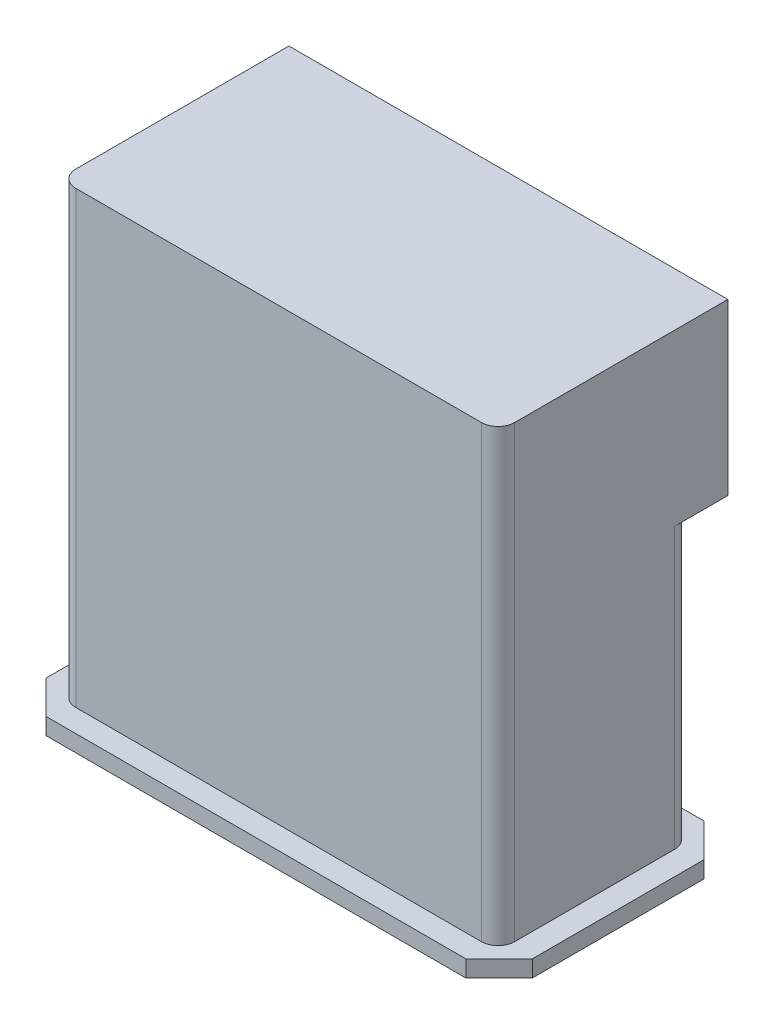
ISO-10303-21;
HEADER;
FILE_DESCRIPTION(('STEP AP214'),'2;1');
FILE_NAME('part.step','',(''),(''),'','','');
FILE_SCHEMA(('AUTOMOTIVE_DESIGN { 1 0 10303 214 1 1 1 1 }'));
ENDSEC;
DATA;
#1=APPLICATION_CONTEXT('core data for automotive mechanical design processes');
#2=APPLICATION_PROTOCOL_DEFINITION('international standard','automotive_design',2000,#1);
#3=PRODUCT_CONTEXT('',#1,'mechanical');
#4=PRODUCT('Part','Part','',(#3));
#5=PRODUCT_RELATED_PRODUCT_CATEGORY('part','',(#4));
#6=PRODUCT_DEFINITION_FORMATION('','',#4);
#7=PRODUCT_DEFINITION_CONTEXT('part definition',#1,'design');
#8=PRODUCT_DEFINITION('design','',#6,#7);
#9=PRODUCT_DEFINITION_SHAPE('','',#8);
#10=(LENGTH_UNIT() NAMED_UNIT(*) SI_UNIT(.MILLI.,.METRE.));
#11=(NAMED_UNIT(*) PLANE_ANGLE_UNIT() SI_UNIT($,.RADIAN.));
#12=(NAMED_UNIT(*) SI_UNIT($,.STERADIAN.) SOLID_ANGLE_UNIT());
#13=UNCERTAINTY_MEASURE_WITH_UNIT(LENGTH_MEASURE(1.E-05),#10,'distance_accuracy_value','');
#14=(GEOMETRIC_REPRESENTATION_CONTEXT(3) GLOBAL_UNCERTAINTY_ASSIGNED_CONTEXT((#13)) GLOBAL_UNIT_ASSIGNED_CONTEXT((#10,
#11,#12)) REPRESENTATION_CONTEXT('',''));
#15=CARTESIAN_POINT('',(0.,0.,0.));
#16=DIRECTION('',(0.,0.,1.));
#17=DIRECTION('',(1.,0.,0.));
#18=AXIS2_PLACEMENT_3D('',#15,#16,#17);
#19=CARTESIAN_POINT('',(0.0899999999999998,-30.5,-7.9));
#20=DIRECTION('',(0.,1.,0.));
#21=DIRECTION('',(0.707106781186548,0.,-0.707106781186547));
#22=AXIS2_PLACEMENT_3D('',#19,#20,#21);
#23=CYLINDRICAL_SURFACE('',#22,0.5);
#24=CARTESIAN_POINT('',(0.0899999999999998,-21.6,-7.9));
#25=DIRECTION('',(0.,-1.,0.));
#26=DIRECTION('',(0.707106781186548,0.,-0.707106781186547));
#27=AXIS2_PLACEMENT_3D('',#24,#25,#26);
#28=CIRCLE('',#27,0.5);
#29=CARTESIAN_POINT('',(0.0899999999999998,-21.6,-8.4));
#30=VERTEX_POINT('',#29);
#31=CARTESIAN_POINT('',(0.59,-21.6,-7.9));
#32=VERTEX_POINT('',#31);
#33=EDGE_CURVE('E10',#30,#32,#28,.T.);
#34=ORIENTED_EDGE('',*,*,#33,.T.);
#35=DIRECTION('',(0.,-1.,0.));
#36=VECTOR('',#35,1.);
#37=CARTESIAN_POINT('',(0.59,-30.5,-7.9));
#38=LINE('',#37,#36);
#39=CARTESIAN_POINT('',(0.59,-30.,-7.9));
#40=VERTEX_POINT('',#39);
#41=EDGE_CURVE('E26',#32,#40,#38,.T.);
#42=ORIENTED_EDGE('',*,*,#41,.T.);
#43=CARTESIAN_POINT('',(0.0899999999999998,-30.,-7.9));
#44=DIRECTION('',(0.,1.,0.));
#45=DIRECTION('',(0.707106781186548,0.,-0.707106781186547));
#46=AXIS2_PLACEMENT_3D('',#43,#44,#45);
#47=CIRCLE('',#46,0.5);
#48=CARTESIAN_POINT('',(0.0899999999999998,-30.,-8.4));
#49=VERTEX_POINT('',#48);
#50=EDGE_CURVE('E50',#40,#49,#47,.T.);
#51=ORIENTED_EDGE('',*,*,#50,.T.);
#52=DIRECTION('',(0.,1.,0.));
#53=VECTOR('',#52,1.);
#54=CARTESIAN_POINT('',(0.0899999999999998,-30.5,-8.4));
#55=LINE('',#54,#53);
#56=EDGE_CURVE('E397',#49,#30,#55,.T.);
#57=ORIENTED_EDGE('',*,*,#56,.T.);
#58=EDGE_LOOP('',(#34,#42,#51,#57));
#59=FACE_BOUND('',#58,.T.);
#60=ADVANCED_FACE('F16',(#59),#23,.T.);
#61=CARTESIAN_POINT('',(0.59,-30.5,-2.6));
#62=DIRECTION('',(1.,0.,0.));
#63=DIRECTION('',(0.,1.,0.));
#64=AXIS2_PLACEMENT_3D('',#61,#62,#63);
#65=PLANE('',#64);
#66=ORIENTED_EDGE('',*,*,#41,.F.);
#67=DIRECTION('',(0.,0.,-1.));
#68=VECTOR('',#67,1.);
#69=CARTESIAN_POINT('',(0.59,-21.6,-8.4));
#70=LINE('',#69,#68);
#71=CARTESIAN_POINT('',(0.59,-21.6,-9.5));
#72=VERTEX_POINT('',#71);
#73=EDGE_CURVE('E383',#32,#72,#70,.T.);
#74=ORIENTED_EDGE('',*,*,#73,.T.);
#75=DIRECTION('',(0.,-1.,0.));
#76=VECTOR('',#75,1.);
#77=CARTESIAN_POINT('',(0.59,-21.6,-9.5));
#78=LINE('',#77,#76);
#79=CARTESIAN_POINT('',(0.59,-16.5,-9.5));
#80=VERTEX_POINT('',#79);
#81=EDGE_CURVE('E369',#80,#72,#78,.T.);
#82=ORIENTED_EDGE('',*,*,#81,.F.);
#83=DIRECTION('',(0.,0.,-1.));
#84=VECTOR('',#83,1.);
#85=CARTESIAN_POINT('',(0.59,-16.5,-8.4));
#86=LINE('',#85,#84);
#87=CARTESIAN_POINT('',(0.59,-16.5,-3.1));
#88=VERTEX_POINT('',#87);
#89=EDGE_CURVE('E413',#88,#80,#86,.T.);
#90=ORIENTED_EDGE('',*,*,#89,.F.);
#91=DIRECTION('',(0.,1.,0.));
#92=VECTOR('',#91,1.);
#93=CARTESIAN_POINT('',(0.59,-30.5,-3.1));
#94=LINE('',#93,#92);
#95=CARTESIAN_POINT('',(0.59,-30.,-3.1));
#96=VERTEX_POINT('',#95);
#97=EDGE_CURVE('E371',#96,#88,#94,.T.);
#98=ORIENTED_EDGE('',*,*,#97,.F.);
#99=DIRECTION('',(0.,0.,-1.));
#100=VECTOR('',#99,1.);
#101=CARTESIAN_POINT('',(0.59,-30.,-4.05));
#102=LINE('',#101,#100);
#103=EDGE_CURVE('E380',#96,#40,#102,.T.);
#104=ORIENTED_EDGE('',*,*,#103,.T.);
#105=EDGE_LOOP('',(#66,#74,#82,#90,#98,#104));
#106=FACE_BOUND('',#105,.T.);
#107=ADVANCED_FACE('F597',(#106),#65,.T.);
#108=CARTESIAN_POINT('',(-12.09,-30.5,-7.9));
#109=DIRECTION('',(0.,1.,0.));
#110=DIRECTION('',(-0.707106781186548,0.,-0.707106781186547));
#111=AXIS2_PLACEMENT_3D('',#108,#109,#110);
#112=CYLINDRICAL_SURFACE('',#111,0.5);
#113=CARTESIAN_POINT('',(-12.09,-21.6,-7.9));
#114=DIRECTION('',(0.,-1.,0.));
#115=DIRECTION('',(-0.707106781186548,0.,-0.707106781186547));
#116=AXIS2_PLACEMENT_3D('',#113,#114,#115);
#117=CIRCLE('',#116,0.5);
#118=CARTESIAN_POINT('',(-12.59,-21.6,-7.9));
#119=VERTEX_POINT('',#118);
#120=CARTESIAN_POINT('',(-12.09,-21.6,-8.4));
#121=VERTEX_POINT('',#120);
#122=EDGE_CURVE('E384',#119,#121,#117,.T.);
#123=ORIENTED_EDGE('',*,*,#122,.T.);
#124=DIRECTION('',(0.,-1.,0.));
#125=VECTOR('',#124,1.);
#126=CARTESIAN_POINT('',(-12.09,-30.5,-8.4));
#127=LINE('',#126,#125);
#128=CARTESIAN_POINT('',(-12.09,-30.,-8.4));
#129=VERTEX_POINT('',#128);
#130=EDGE_CURVE('E396',#121,#129,#127,.T.);
#131=ORIENTED_EDGE('',*,*,#130,.T.);
#132=CARTESIAN_POINT('',(-12.09,-30.,-7.9));
#133=DIRECTION('',(0.,1.,0.));
#134=DIRECTION('',(-0.707106781186548,0.,-0.707106781186547));
#135=AXIS2_PLACEMENT_3D('',#132,#133,#134);
#136=CIRCLE('',#135,0.5);
#137=CARTESIAN_POINT('',(-12.59,-30.,-7.9));
#138=VERTEX_POINT('',#137);
#139=EDGE_CURVE('E521',#129,#138,#136,.T.);
#140=ORIENTED_EDGE('',*,*,#139,.T.);
#141=DIRECTION('',(0.,1.,0.));
#142=VECTOR('',#141,1.);
#143=CARTESIAN_POINT('',(-12.59,-30.5,-7.9));
#144=LINE('',#143,#142);
#145=EDGE_CURVE('E524',#138,#119,#144,.T.);
#146=ORIENTED_EDGE('',*,*,#145,.T.);
#147=EDGE_LOOP('',(#123,#131,#140,#146));
#148=FACE_BOUND('',#147,.T.);
#149=ADVANCED_FACE('F523',(#148),#112,.T.);
#150=CARTESIAN_POINT('',(0.59,-30.5,-8.4));
#151=DIRECTION('',(0.,0.,-1.));
#152=DIRECTION('',(0.,-1.,0.));
#153=AXIS2_PLACEMENT_3D('',#150,#151,#152);
#154=PLANE('',#153);
#155=ORIENTED_EDGE('',*,*,#56,.F.);
#156=DIRECTION('',(-1.,0.,0.));
#157=VECTOR('',#156,1.);
#158=CARTESIAN_POINT('',(-2.705,-30.,-8.4));
#159=LINE('',#158,#157);
#160=EDGE_CURVE('E420',#49,#129,#159,.T.);
#161=ORIENTED_EDGE('',*,*,#160,.T.);
#162=ORIENTED_EDGE('',*,*,#130,.F.);
#163=DIRECTION('',(1.,0.,0.));
#164=VECTOR('',#163,1.);
#165=CARTESIAN_POINT('',(0.59,-21.6,-8.4));
#166=LINE('',#165,#164);
#167=CARTESIAN_POINT('',(-7.225,-21.6,-8.4));
#168=VERTEX_POINT('',#167);
#169=EDGE_CURVE('E354',#121,#168,#166,.T.);
#170=ORIENTED_EDGE('',*,*,#169,.T.);
#171=DIRECTION('',(0.,-1.,0.));
#172=VECTOR('',#171,1.);
#173=CARTESIAN_POINT('',(-7.225,-27.5,-8.4));
#174=LINE('',#173,#172);
#175=CARTESIAN_POINT('',(-7.225,-24.5,-8.4));
#176=VERTEX_POINT('',#175);
#177=EDGE_CURVE('E350',#168,#176,#174,.T.);
#178=ORIENTED_EDGE('',*,*,#177,.T.);
#179=DIRECTION('',(1.,0.,0.));
#180=VECTOR('',#179,1.);
#181=CARTESIAN_POINT('',(-2.0925,-24.5,-8.4));
#182=LINE('',#181,#180);
#183=CARTESIAN_POINT('',(-4.775,-24.5,-8.4));
#184=VERTEX_POINT('',#183);
#185=EDGE_CURVE('E327',#176,#184,#182,.T.);
#186=ORIENTED_EDGE('',*,*,#185,.T.);
#187=DIRECTION('',(0.,1.,0.));
#188=VECTOR('',#187,1.);
#189=CARTESIAN_POINT('',(-4.775,-26.05,-8.4));
#190=LINE('',#189,#188);
#191=CARTESIAN_POINT('',(-4.775,-21.6,-8.4));
#192=VERTEX_POINT('',#191);
#193=EDGE_CURVE('E323',#184,#192,#190,.T.);
#194=ORIENTED_EDGE('',*,*,#193,.T.);
#195=DIRECTION('',(1.,0.,0.));
#196=VECTOR('',#195,1.);
#197=CARTESIAN_POINT('',(0.59,-21.6,-8.4));
#198=LINE('',#197,#196);
#199=EDGE_CURVE('E328',#192,#30,#198,.T.);
#200=ORIENTED_EDGE('',*,*,#199,.T.);
#201=EDGE_LOOP('',(#155,#161,#162,#170,#178,#186,#194,#200));
#202=FACE_BOUND('',#201,.T.);
#203=ADVANCED_FACE('F515',(#202),#154,.T.);
#204=CARTESIAN_POINT('',(0.0899999999999998,-30.5,-3.1));
#205=DIRECTION('',(0.,1.,0.));
#206=DIRECTION('',(0.707106781186548,0.,0.707106781186547));
#207=AXIS2_PLACEMENT_3D('',#204,#205,#206);
#208=CYLINDRICAL_SURFACE('',#207,0.5);
#209=CARTESIAN_POINT('',(0.0899999999999998,-16.5,-3.1));
#210=DIRECTION('',(0.,-1.,0.));
#211=DIRECTION('',(0.707106781186548,0.,0.707106781186547));
#212=AXIS2_PLACEMENT_3D('',#209,#210,#211);
#213=CIRCLE('',#212,0.5);
#214=CARTESIAN_POINT('',(0.0899999999999998,-16.5,-2.6));
#215=VERTEX_POINT('',#214);
#216=EDGE_CURVE('E389',#88,#215,#213,.T.);
#217=ORIENTED_EDGE('',*,*,#216,.T.);
#218=DIRECTION('',(0.,-1.,0.));
#219=VECTOR('',#218,1.);
#220=CARTESIAN_POINT('',(0.0899999999999998,-30.5,-2.6));
#221=LINE('',#220,#219);
#222=CARTESIAN_POINT('',(0.0899999999999998,-30.,-2.6));
#223=VERTEX_POINT('',#222);
#224=EDGE_CURVE('E385',#215,#223,#221,.T.);
#225=ORIENTED_EDGE('',*,*,#224,.T.);
#226=CARTESIAN_POINT('',(0.0899999999999998,-30.,-3.1));
#227=DIRECTION('',(0.,1.,0.));
#228=DIRECTION('',(0.707106781186548,0.,0.707106781186547));
#229=AXIS2_PLACEMENT_3D('',#226,#227,#228);
#230=CIRCLE('',#229,0.5);
#231=EDGE_CURVE('E375',#223,#96,#230,.T.);
#232=ORIENTED_EDGE('',*,*,#231,.T.);
#233=ORIENTED_EDGE('',*,*,#97,.T.);
#234=EDGE_LOOP('',(#217,#225,#232,#233));
#235=FACE_BOUND('',#234,.T.);
#236=ADVANCED_FACE('F474',(#235),#208,.T.);
#237=CARTESIAN_POINT('',(-12.59,-30.5,-2.6));
#238=DIRECTION('',(0.,0.,1.));
#239=DIRECTION('',(1.,0.,0.));
#240=AXIS2_PLACEMENT_3D('',#237,#238,#239);
#241=PLANE('',#240);
#242=ORIENTED_EDGE('',*,*,#224,.F.);
#243=DIRECTION('',(1.,0.,0.));
#244=VECTOR('',#243,1.);
#245=CARTESIAN_POINT('',(0.59,-16.5,-2.6));
#246=LINE('',#245,#244);
#247=CARTESIAN_POINT('',(-12.09,-16.5,-2.6));
#248=VERTEX_POINT('',#247);
#249=EDGE_CURVE('E409',#248,#215,#246,.T.);
#250=ORIENTED_EDGE('',*,*,#249,.F.);
#251=DIRECTION('',(0.,1.,0.));
#252=VECTOR('',#251,1.);
#253=CARTESIAN_POINT('',(-12.09,-30.5,-2.6));
#254=LINE('',#253,#252);
#255=CARTESIAN_POINT('',(-12.09,-30.,-2.6));
#256=VERTEX_POINT('',#255);
#257=EDGE_CURVE('E90',#256,#248,#254,.T.);
#258=ORIENTED_EDGE('',*,*,#257,.F.);
#259=DIRECTION('',(1.,0.,0.));
#260=VECTOR('',#259,1.);
#261=CARTESIAN_POINT('',(-9.295,-30.,-2.6));
#262=LINE('',#261,#260);
#263=EDGE_CURVE('E376',#256,#223,#262,.T.);
#264=ORIENTED_EDGE('',*,*,#263,.T.);
#265=EDGE_LOOP('',(#242,#250,#258,#264));
#266=FACE_BOUND('',#265,.T.);
#267=ADVANCED_FACE('F480',(#266),#241,.T.);
#268=CARTESIAN_POINT('',(-6.,-16.5,-5.5));
#269=DIRECTION('',(0.,1.,0.));
#270=DIRECTION('',(1.,0.,0.));
#271=AXIS2_PLACEMENT_3D('',#268,#269,#270);
#272=PLANE('',#271);
#273=ORIENTED_EDGE('',*,*,#216,.F.);
#274=ORIENTED_EDGE('',*,*,#89,.T.);
#275=DIRECTION('',(1.,0.,0.));
#276=VECTOR('',#275,1.);
#277=CARTESIAN_POINT('',(0.59,-16.5,-9.5));
#278=LINE('',#277,#276);
#279=CARTESIAN_POINT('',(-12.59,-16.5,-9.5));
#280=VERTEX_POINT('',#279);
#281=EDGE_CURVE('E365',#280,#80,#278,.T.);
#282=ORIENTED_EDGE('',*,*,#281,.F.);
#283=DIRECTION('',(0.,0.,-1.));
#284=VECTOR('',#283,1.);
#285=CARTESIAN_POINT('',(-12.59,-16.5,-8.4));
#286=LINE('',#285,#284);
#287=CARTESIAN_POINT('',(-12.59,-16.5,-3.1));
#288=VERTEX_POINT('',#287);
#289=EDGE_CURVE('E450',#288,#280,#286,.T.);
#290=ORIENTED_EDGE('',*,*,#289,.F.);
#291=CARTESIAN_POINT('',(-12.09,-16.5,-3.1));
#292=DIRECTION('',(0.,-1.,0.));
#293=DIRECTION('',(-0.707106781186548,0.,0.707106781186547));
#294=AXIS2_PLACEMENT_3D('',#291,#292,#293);
#295=CIRCLE('',#294,0.5);
#296=EDGE_CURVE('E414',#248,#288,#295,.T.);
#297=ORIENTED_EDGE('',*,*,#296,.F.);
#298=ORIENTED_EDGE('',*,*,#249,.T.);
#299=EDGE_LOOP('',(#273,#274,#282,#290,#297,#298));
#300=FACE_BOUND('',#299,.T.);
#301=ADVANCED_FACE('F479',(#300),#272,.T.);
#302=CARTESIAN_POINT('',(-12.09,-30.5,-3.1));
#303=DIRECTION('',(0.,1.,0.));
#304=DIRECTION('',(-0.707106781186548,0.,0.707106781186547));
#305=AXIS2_PLACEMENT_3D('',#302,#303,#304);
#306=CYLINDRICAL_SURFACE('',#305,0.5);
#307=ORIENTED_EDGE('',*,*,#296,.T.);
#308=DIRECTION('',(0.,-1.,0.));
#309=VECTOR('',#308,1.);
#310=CARTESIAN_POINT('',(-12.59,-30.5,-3.1));
#311=LINE('',#310,#309);
#312=CARTESIAN_POINT('',(-12.59,-30.,-3.1));
#313=VERTEX_POINT('',#312);
#314=EDGE_CURVE('E392',#288,#313,#311,.T.);
#315=ORIENTED_EDGE('',*,*,#314,.T.);
#316=CARTESIAN_POINT('',(-12.09,-30.,-3.1));
#317=DIRECTION('',(0.,1.,0.));
#318=DIRECTION('',(-0.707106781186548,0.,0.707106781186547));
#319=AXIS2_PLACEMENT_3D('',#316,#317,#318);
#320=CIRCLE('',#319,0.5);
#321=EDGE_CURVE('E331',#313,#256,#320,.T.);
#322=ORIENTED_EDGE('',*,*,#321,.T.);
#323=ORIENTED_EDGE('',*,*,#257,.T.);
#324=EDGE_LOOP('',(#307,#315,#322,#323));
#325=FACE_BOUND('',#324,.T.);
#326=ADVANCED_FACE('F611',(#325),#306,.T.);
#327=CARTESIAN_POINT('',(-4.775,-24.5,-8.4));
#328=DIRECTION('',(0.,-1.,0.));
#329=DIRECTION('',(0.,0.,-1.));
#330=AXIS2_PLACEMENT_3D('',#327,#328,#329);
#331=PLANE('',#330);
#332=ORIENTED_EDGE('',*,*,#185,.F.);
#333=DIRECTION('',(0.,0.,-1.));
#334=VECTOR('',#333,1.);
#335=CARTESIAN_POINT('',(-7.225,-24.5,-8.4));
#336=LINE('',#335,#334);
#337=CARTESIAN_POINT('',(-7.225,-24.5,-9.5));
#338=VERTEX_POINT('',#337);
#339=EDGE_CURVE('E332',#176,#338,#336,.T.);
#340=ORIENTED_EDGE('',*,*,#339,.T.);
#341=DIRECTION('',(-1.,0.,0.));
#342=VECTOR('',#341,1.);
#343=CARTESIAN_POINT('',(-4.775,-24.5,-9.5));
#344=LINE('',#343,#342);
#345=CARTESIAN_POINT('',(-4.775,-24.5,-9.5));
#346=VERTEX_POINT('',#345);
#347=EDGE_CURVE('E202',#346,#338,#344,.T.);
#348=ORIENTED_EDGE('',*,*,#347,.F.);
#349=DIRECTION('',(0.,0.,-1.));
#350=VECTOR('',#349,1.);
#351=CARTESIAN_POINT('',(-4.775,-24.5,-8.4));
#352=LINE('',#351,#350);
#353=EDGE_CURVE('E358',#184,#346,#352,.T.);
#354=ORIENTED_EDGE('',*,*,#353,.F.);
#355=EDGE_LOOP('',(#332,#340,#348,#354));
#356=FACE_BOUND('',#355,.T.);
#357=ADVANCED_FACE('F609',(#356),#331,.T.);
#358=CARTESIAN_POINT('',(-4.775,-21.6,-8.4));
#359=DIRECTION('',(1.,0.,0.));
#360=DIRECTION('',(0.,1.,0.));
#361=AXIS2_PLACEMENT_3D('',#358,#359,#360);
#362=PLANE('',#361);
#363=ORIENTED_EDGE('',*,*,#193,.F.);
#364=ORIENTED_EDGE('',*,*,#353,.T.);
#365=DIRECTION('',(0.,-1.,0.));
#366=VECTOR('',#365,1.);
#367=CARTESIAN_POINT('',(-4.775,-16.5,-9.5));
#368=LINE('',#367,#366);
#369=CARTESIAN_POINT('',(-4.775,-21.6,-9.5));
#370=VERTEX_POINT('',#369);
#371=EDGE_CURVE('E190',#370,#346,#368,.T.);
#372=ORIENTED_EDGE('',*,*,#371,.F.);
#373=DIRECTION('',(0.,0.,-1.));
#374=VECTOR('',#373,1.);
#375=CARTESIAN_POINT('',(-4.775,-21.6,-8.4));
#376=LINE('',#375,#374);
#377=EDGE_CURVE('E355',#192,#370,#376,.T.);
#378=ORIENTED_EDGE('',*,*,#377,.F.);
#379=EDGE_LOOP('',(#363,#364,#372,#378));
#380=FACE_BOUND('',#379,.T.);
#381=ADVANCED_FACE('F608',(#380),#362,.T.);
#382=CARTESIAN_POINT('',(-7.225,-24.5,-8.4));
#383=DIRECTION('',(-1.,0.,0.));
#384=DIRECTION('',(0.,0.,1.));
#385=AXIS2_PLACEMENT_3D('',#382,#383,#384);
#386=PLANE('',#385);
#387=ORIENTED_EDGE('',*,*,#177,.F.);
#388=DIRECTION('',(0.,0.,1.));
#389=VECTOR('',#388,1.);
#390=CARTESIAN_POINT('',(-7.225,-21.6,-8.4));
#391=LINE('',#390,#389);
#392=CARTESIAN_POINT('',(-7.225,-21.6,-9.5));
#393=VERTEX_POINT('',#392);
#394=EDGE_CURVE('E359',#393,#168,#391,.T.);
#395=ORIENTED_EDGE('',*,*,#394,.F.);
#396=DIRECTION('',(0.,1.,0.));
#397=VECTOR('',#396,1.);
#398=CARTESIAN_POINT('',(-7.225,-24.5,-9.5));
#399=LINE('',#398,#397);
#400=EDGE_CURVE('E379',#338,#393,#399,.T.);
#401=ORIENTED_EDGE('',*,*,#400,.F.);
#402=ORIENTED_EDGE('',*,*,#339,.F.);
#403=EDGE_LOOP('',(#387,#395,#401,#402));
#404=FACE_BOUND('',#403,.T.);
#405=ADVANCED_FACE('F511',(#404),#386,.T.);
#406=CARTESIAN_POINT('',(0.59,-21.6,-8.4));
#407=DIRECTION('',(0.,-1.,0.));
#408=DIRECTION('',(0.,0.,-1.));
#409=AXIS2_PLACEMENT_3D('',#406,#407,#408);
#410=PLANE('',#409);
#411=ORIENTED_EDGE('',*,*,#377,.T.);
#412=DIRECTION('',(-1.,0.,0.));
#413=VECTOR('',#412,1.);
#414=CARTESIAN_POINT('',(-12.59,-21.6,-9.5));
#415=LINE('',#414,#413);
#416=EDGE_CURVE('E428',#72,#370,#415,.T.);
#417=ORIENTED_EDGE('',*,*,#416,.F.);
#418=ORIENTED_EDGE('',*,*,#73,.F.);
#419=ORIENTED_EDGE('',*,*,#33,.F.);
#420=ORIENTED_EDGE('',*,*,#199,.F.);
#421=EDGE_LOOP('',(#411,#417,#418,#419,#420));
#422=FACE_BOUND('',#421,.T.);
#423=ADVANCED_FACE('F607',(#422),#410,.T.);
#424=CARTESIAN_POINT('',(0.59,-21.6,-8.4));
#425=DIRECTION('',(0.,-1.,0.));
#426=DIRECTION('',(0.,0.,-1.));
#427=AXIS2_PLACEMENT_3D('',#424,#425,#426);
#428=PLANE('',#427);
#429=ORIENTED_EDGE('',*,*,#394,.T.);
#430=ORIENTED_EDGE('',*,*,#169,.F.);
#431=ORIENTED_EDGE('',*,*,#122,.F.);
#432=DIRECTION('',(0.,0.,-1.));
#433=VECTOR('',#432,1.);
#434=CARTESIAN_POINT('',(-12.59,-21.6,-8.4));
#435=LINE('',#434,#433);
#436=CARTESIAN_POINT('',(-12.59,-21.6,-9.5));
#437=VERTEX_POINT('',#436);
#438=EDGE_CURVE('E431',#119,#437,#435,.T.);
#439=ORIENTED_EDGE('',*,*,#438,.T.);
#440=DIRECTION('',(-1.,0.,0.));
#441=VECTOR('',#440,1.);
#442=CARTESIAN_POINT('',(-12.59,-21.6,-9.5));
#443=LINE('',#442,#441);
#444=EDGE_CURVE('E490',#393,#437,#443,.T.);
#445=ORIENTED_EDGE('',*,*,#444,.F.);
#446=EDGE_LOOP('',(#429,#430,#431,#439,#445));
#447=FACE_BOUND('',#446,.T.);
#448=ADVANCED_FACE('F507',(#447),#428,.T.);
#449=CARTESIAN_POINT('',(-6.,-19.05,-9.5));
#450=DIRECTION('',(0.,0.,-1.));
#451=DIRECTION('',(0.,-1.,0.));
#452=AXIS2_PLACEMENT_3D('',#449,#450,#451);
#453=PLANE('',#452);
#454=ORIENTED_EDGE('',*,*,#416,.T.);
#455=ORIENTED_EDGE('',*,*,#371,.T.);
#456=ORIENTED_EDGE('',*,*,#347,.T.);
#457=ORIENTED_EDGE('',*,*,#400,.T.);
#458=ORIENTED_EDGE('',*,*,#444,.T.);
#459=DIRECTION('',(0.,1.,0.));
#460=VECTOR('',#459,1.);
#461=CARTESIAN_POINT('',(-12.59,-16.5,-9.5));
#462=LINE('',#461,#460);
#463=EDGE_CURVE('E368',#437,#280,#462,.T.);
#464=ORIENTED_EDGE('',*,*,#463,.T.);
#465=ORIENTED_EDGE('',*,*,#281,.T.);
#466=ORIENTED_EDGE('',*,*,#81,.T.);
#467=EDGE_LOOP('',(#454,#455,#456,#457,#458,#464,#465,#466));
#468=FACE_BOUND('',#467,.T.);
#469=ADVANCED_FACE('F600',(#468),#453,.T.);
#470=CARTESIAN_POINT('',(-12.8,-30.5,-2.42));
#471=DIRECTION('',(-0.707106781186547,0.,0.707106781186548));
#472=DIRECTION('',(0.,1.,0.));
#473=AXIS2_PLACEMENT_3D('',#470,#471,#472);
#474=PLANE('',#473);
#475=DIRECTION('',(-0.707106781186548,0.,-0.707106781186547));
#476=VECTOR('',#475,1.);
#477=CARTESIAN_POINT('',(-11.87,-30.,-1.49));
#478=LINE('',#477,#476);
#479=CARTESIAN_POINT('',(-12.3,-30.,-1.92));
#480=VERTEX_POINT('',#479);
#481=CARTESIAN_POINT('',(-13.3,-30.,-2.92));
#482=VERTEX_POINT('',#481);
#483=EDGE_CURVE('E542',#480,#482,#478,.T.);
#484=ORIENTED_EDGE('',*,*,#483,.T.);
#485=DIRECTION('',(0.,-1.,0.));
#486=VECTOR('',#485,1.);
#487=CARTESIAN_POINT('',(-13.3,-30.5,-2.92));
#488=LINE('',#487,#486);
#489=CARTESIAN_POINT('',(-13.3,-30.5,-2.92));
#490=VERTEX_POINT('',#489);
#491=EDGE_CURVE('E546',#482,#490,#488,.T.);
#492=ORIENTED_EDGE('',*,*,#491,.T.);
#493=DIRECTION('',(0.707106781186548,0.,0.707106781186547));
#494=VECTOR('',#493,1.);
#495=CARTESIAN_POINT('',(-11.87,-30.5,-1.49));
#496=LINE('',#495,#494);
#497=CARTESIAN_POINT('',(-12.3,-30.5,-1.92));
#498=VERTEX_POINT('',#497);
#499=EDGE_CURVE('E554',#490,#498,#496,.T.);
#500=ORIENTED_EDGE('',*,*,#499,.T.);
#501=DIRECTION('',(0.,1.,0.));
#502=VECTOR('',#501,1.);
#503=CARTESIAN_POINT('',(-12.3,-30.5,-1.92));
#504=LINE('',#503,#502);
#505=EDGE_CURVE('E335',#498,#480,#504,.T.);
#506=ORIENTED_EDGE('',*,*,#505,.T.);
#507=EDGE_LOOP('',(#484,#492,#500,#506));
#508=FACE_BOUND('',#507,.T.);
#509=ADVANCED_FACE('F640',(#508),#474,.T.);
#510=CARTESIAN_POINT('',(-13.3,-30.5,-9.08));
#511=DIRECTION('',(-1.,0.,0.));
#512=DIRECTION('',(0.,0.,1.));
#513=AXIS2_PLACEMENT_3D('',#510,#511,#512);
#514=PLANE('',#513);
#515=ORIENTED_EDGE('',*,*,#491,.F.);
#516=DIRECTION('',(0.,0.,1.));
#517=VECTOR('',#516,1.);
#518=CARTESIAN_POINT('',(-13.3,-30.,-9.08));
#519=LINE('',#518,#517);
#520=CARTESIAN_POINT('',(-13.3,-30.,-8.08));
#521=VERTEX_POINT('',#520);
#522=EDGE_CURVE('E360',#521,#482,#519,.T.);
#523=ORIENTED_EDGE('',*,*,#522,.F.);
#524=DIRECTION('',(0.,1.,0.));
#525=VECTOR('',#524,1.);
#526=CARTESIAN_POINT('',(-13.3,-30.5,-8.08));
#527=LINE('',#526,#525);
#528=CARTESIAN_POINT('',(-13.3,-30.5,-8.08));
#529=VERTEX_POINT('',#528);
#530=EDGE_CURVE('E295',#529,#521,#527,.T.);
#531=ORIENTED_EDGE('',*,*,#530,.F.);
#532=DIRECTION('',(0.,0.,1.));
#533=VECTOR('',#532,1.);
#534=CARTESIAN_POINT('',(-13.3,-30.5,-9.08));
#535=LINE('',#534,#533);
#536=EDGE_CURVE('E291',#529,#490,#535,.T.);
#537=ORIENTED_EDGE('',*,*,#536,.T.);
#538=EDGE_LOOP('',(#515,#523,#531,#537));
#539=FACE_BOUND('',#538,.T.);
#540=ADVANCED_FACE('F643',(#539),#514,.T.);
#541=CARTESIAN_POINT('',(-6.,-30.,-5.5));
#542=DIRECTION('',(0.,1.,0.));
#543=DIRECTION('',(1.,0.,0.));
#544=AXIS2_PLACEMENT_3D('',#541,#542,#543);
#545=PLANE('',#544);
#546=ORIENTED_EDGE('',*,*,#483,.F.);
#547=DIRECTION('',(1.,0.,0.));
#548=VECTOR('',#547,1.);
#549=CARTESIAN_POINT('',(-13.3,-30.,-1.92));
#550=LINE('',#549,#548);
#551=CARTESIAN_POINT('',(0.3,-30.,-1.92));
#552=VERTEX_POINT('',#551);
#553=EDGE_CURVE('E336',#480,#552,#550,.T.);
#554=ORIENTED_EDGE('',*,*,#553,.T.);
#555=DIRECTION('',(-0.707106781186548,0.,0.707106781186548));
#556=VECTOR('',#555,1.);
#557=CARTESIAN_POINT('',(-0.13,-30.,-1.49));
#558=LINE('',#557,#556);
#559=CARTESIAN_POINT('',(1.3,-30.,-2.92));
#560=VERTEX_POINT('',#559);
#561=EDGE_CURVE('E20',#560,#552,#558,.T.);
#562=ORIENTED_EDGE('',*,*,#561,.F.);
#563=DIRECTION('',(0.,0.,-1.));
#564=VECTOR('',#563,1.);
#565=CARTESIAN_POINT('',(1.3,-30.,-1.92));
#566=LINE('',#565,#564);
#567=CARTESIAN_POINT('',(1.3,-30.,-8.08));
#568=VERTEX_POINT('',#567);
#569=EDGE_CURVE('E344',#560,#568,#566,.T.);
#570=ORIENTED_EDGE('',*,*,#569,.T.);
#571=DIRECTION('',(0.707106781186548,0.,0.707106781186547));
#572=VECTOR('',#571,1.);
#573=CARTESIAN_POINT('',(-0.13,-30.,-9.51));
#574=LINE('',#573,#572);
#575=CARTESIAN_POINT('',(0.3,-30.,-9.08));
#576=VERTEX_POINT('',#575);
#577=EDGE_CURVE('E310',#576,#568,#574,.T.);
#578=ORIENTED_EDGE('',*,*,#577,.F.);
#579=DIRECTION('',(-1.,0.,0.));
#580=VECTOR('',#579,1.);
#581=CARTESIAN_POINT('',(1.3,-30.,-9.08));
#582=LINE('',#581,#580);
#583=CARTESIAN_POINT('',(-12.3,-30.,-9.08));
#584=VERTEX_POINT('',#583);
#585=EDGE_CURVE('E364',#576,#584,#582,.T.);
#586=ORIENTED_EDGE('',*,*,#585,.T.);
#587=DIRECTION('',(0.707106781186548,0.,-0.707106781186547));
#588=VECTOR('',#587,1.);
#589=CARTESIAN_POINT('',(-11.87,-30.,-9.51));
#590=LINE('',#589,#588);
#591=EDGE_CURVE('E300',#521,#584,#590,.T.);
#592=ORIENTED_EDGE('',*,*,#591,.F.);
#593=ORIENTED_EDGE('',*,*,#522,.T.);
#594=EDGE_LOOP('',(#546,#554,#562,#570,#578,#586,#592,#593));
#595=FACE_BOUND('',#594,.T.);
#596=ORIENTED_EDGE('',*,*,#103,.F.);
#597=ORIENTED_EDGE('',*,*,#231,.F.);
#598=ORIENTED_EDGE('',*,*,#263,.F.);
#599=ORIENTED_EDGE('',*,*,#321,.F.);
#600=DIRECTION('',(0.,0.,1.));
#601=VECTOR('',#600,1.);
#602=CARTESIAN_POINT('',(-12.59,-30.,-6.95));
#603=LINE('',#602,#601);
#604=EDGE_CURVE('E463',#138,#313,#603,.T.);
#605=ORIENTED_EDGE('',*,*,#604,.F.);
#606=ORIENTED_EDGE('',*,*,#139,.F.);
#607=ORIENTED_EDGE('',*,*,#160,.F.);
#608=ORIENTED_EDGE('',*,*,#50,.F.);
#609=EDGE_LOOP('',(#596,#597,#598,#599,#605,#606,#607,#608));
#610=FACE_BOUND('',#609,.T.);
#611=ADVANCED_FACE('F596',(#595,#610),#545,.T.);
#612=CARTESIAN_POINT('',(-12.8,-30.5,-8.58));
#613=DIRECTION('',(-0.707106781186547,0.,-0.707106781186548));
#614=DIRECTION('',(-0.707106781186548,0.,0.707106781186547));
#615=AXIS2_PLACEMENT_3D('',#612,#613,#614);
#616=PLANE('',#615);
#617=ORIENTED_EDGE('',*,*,#591,.T.);
#618=DIRECTION('',(0.,-1.,0.));
#619=VECTOR('',#618,1.);
#620=CARTESIAN_POINT('',(-12.3,-30.5,-9.08));
#621=LINE('',#620,#619);
#622=CARTESIAN_POINT('',(-12.3,-30.5,-9.08));
#623=VERTEX_POINT('',#622);
#624=EDGE_CURVE('E294',#584,#623,#621,.T.);
#625=ORIENTED_EDGE('',*,*,#624,.T.);
#626=DIRECTION('',(-0.707106781186548,0.,0.707106781186547));
#627=VECTOR('',#626,1.);
#628=CARTESIAN_POINT('',(-11.87,-30.5,-9.51));
#629=LINE('',#628,#627);
#630=EDGE_CURVE('E283',#623,#529,#629,.T.);
#631=ORIENTED_EDGE('',*,*,#630,.T.);
#632=ORIENTED_EDGE('',*,*,#530,.T.);
#633=EDGE_LOOP('',(#617,#625,#631,#632));
#634=FACE_BOUND('',#633,.T.);
#635=ADVANCED_FACE('F298',(#634),#616,.T.);
#636=CARTESIAN_POINT('',(1.3,-30.5,-9.08));
#637=DIRECTION('',(0.,0.,-1.));
#638=DIRECTION('',(0.,-1.,0.));
#639=AXIS2_PLACEMENT_3D('',#636,#637,#638);
#640=PLANE('',#639);
#641=ORIENTED_EDGE('',*,*,#624,.F.);
#642=ORIENTED_EDGE('',*,*,#585,.F.);
#643=DIRECTION('',(0.,1.,0.));
#644=VECTOR('',#643,1.);
#645=CARTESIAN_POINT('',(0.3,-30.5,-9.08));
#646=LINE('',#645,#644);
#647=CARTESIAN_POINT('',(0.3,-30.5,-9.08));
#648=VERTEX_POINT('',#647);
#649=EDGE_CURVE('E308',#648,#576,#646,.T.);
#650=ORIENTED_EDGE('',*,*,#649,.F.);
#651=DIRECTION('',(-1.,0.,0.));
#652=VECTOR('',#651,1.);
#653=CARTESIAN_POINT('',(1.3,-30.5,-9.08));
#654=LINE('',#653,#652);
#655=EDGE_CURVE('E288',#648,#623,#654,.T.);
#656=ORIENTED_EDGE('',*,*,#655,.T.);
#657=EDGE_LOOP('',(#641,#642,#650,#656));
#658=FACE_BOUND('',#657,.T.);
#659=ADVANCED_FACE('F306',(#658),#640,.T.);
#660=CARTESIAN_POINT('',(0.799999999999999,-30.5,-8.58));
#661=DIRECTION('',(0.707106781186547,0.,-0.707106781186548));
#662=DIRECTION('',(0.,-1.,0.));
#663=AXIS2_PLACEMENT_3D('',#660,#661,#662);
#664=PLANE('',#663);
#665=ORIENTED_EDGE('',*,*,#577,.T.);
#666=DIRECTION('',(0.,-1.,0.));
#667=VECTOR('',#666,1.);
#668=CARTESIAN_POINT('',(1.3,-30.5,-8.08));
#669=LINE('',#668,#667);
#670=CARTESIAN_POINT('',(1.3,-30.5,-8.08));
#671=VERTEX_POINT('',#670);
#672=EDGE_CURVE('E318',#568,#671,#669,.T.);
#673=ORIENTED_EDGE('',*,*,#672,.T.);
#674=DIRECTION('',(-0.707106781186548,0.,-0.707106781186547));
#675=VECTOR('',#674,1.);
#676=CARTESIAN_POINT('',(-0.13,-30.5,-9.51));
#677=LINE('',#676,#675);
#678=EDGE_CURVE('E340',#671,#648,#677,.T.);
#679=ORIENTED_EDGE('',*,*,#678,.T.);
#680=ORIENTED_EDGE('',*,*,#649,.T.);
#681=EDGE_LOOP('',(#665,#673,#679,#680));
#682=FACE_BOUND('',#681,.T.);
#683=ADVANCED_FACE('F655',(#682),#664,.T.);
#684=CARTESIAN_POINT('',(1.3,-30.5,-1.92));
#685=DIRECTION('',(1.,0.,0.));
#686=DIRECTION('',(0.,1.,0.));
#687=AXIS2_PLACEMENT_3D('',#684,#685,#686);
#688=PLANE('',#687);
#689=ORIENTED_EDGE('',*,*,#672,.F.);
#690=ORIENTED_EDGE('',*,*,#569,.F.);
#691=DIRECTION('',(0.,1.,0.));
#692=VECTOR('',#691,1.);
#693=CARTESIAN_POINT('',(1.3,-30.5,-2.92));
#694=LINE('',#693,#692);
#695=CARTESIAN_POINT('',(1.3,-30.5,-2.92));
#696=VERTEX_POINT('',#695);
#697=EDGE_CURVE('E400',#696,#560,#694,.T.);
#698=ORIENTED_EDGE('',*,*,#697,.F.);
#699=DIRECTION('',(0.,0.,-1.));
#700=VECTOR('',#699,1.);
#701=CARTESIAN_POINT('',(1.3,-30.5,-1.92));
#702=LINE('',#701,#700);
#703=EDGE_CURVE('E588',#696,#671,#702,.T.);
#704=ORIENTED_EDGE('',*,*,#703,.T.);
#705=EDGE_LOOP('',(#689,#690,#698,#704));
#706=FACE_BOUND('',#705,.T.);
#707=ADVANCED_FACE('F651',(#706),#688,.T.);
#708=CARTESIAN_POINT('',(0.799999999999999,-30.5,-2.42));
#709=DIRECTION('',(0.707106781186548,0.,0.707106781186548));
#710=DIRECTION('',(0.,-1.,0.));
#711=AXIS2_PLACEMENT_3D('',#708,#709,#710);
#712=PLANE('',#711);
#713=ORIENTED_EDGE('',*,*,#561,.T.);
#714=DIRECTION('',(0.,-1.,0.));
#715=VECTOR('',#714,1.);
#716=CARTESIAN_POINT('',(0.3,-30.5,-1.92));
#717=LINE('',#716,#715);
#718=CARTESIAN_POINT('',(0.3,-30.5,-1.92));
#719=VERTEX_POINT('',#718);
#720=EDGE_CURVE('E322',#552,#719,#717,.T.);
#721=ORIENTED_EDGE('',*,*,#720,.T.);
#722=DIRECTION('',(0.707106781186548,0.,-0.707106781186548));
#723=VECTOR('',#722,1.);
#724=CARTESIAN_POINT('',(-0.13,-30.5,-1.49));
#725=LINE('',#724,#723);
#726=EDGE_CURVE('E404',#719,#696,#725,.T.);
#727=ORIENTED_EDGE('',*,*,#726,.T.);
#728=ORIENTED_EDGE('',*,*,#697,.T.);
#729=EDGE_LOOP('',(#713,#721,#727,#728));
#730=FACE_BOUND('',#729,.T.);
#731=ADVANCED_FACE('F647',(#730),#712,.T.);
#732=CARTESIAN_POINT('',(-12.09,-30.5,-7.9));
#733=DIRECTION('',(-1.,0.,0.));
#734=DIRECTION('',(0.,0.,1.));
#735=AXIS2_PLACEMENT_3D('',#732,#733,#734);
#736=PLANE('',#735);
#737=DIRECTION('',(0.,0.,1.));
#738=VECTOR('',#737,1.);
#739=CARTESIAN_POINT('',(-12.09,-30.5,-6.7));
#740=LINE('',#739,#738);
#741=CARTESIAN_POINT('',(-12.09,-30.5,-7.9));
#742=VERTEX_POINT('',#741);
#743=CARTESIAN_POINT('',(-12.09,-30.5,-3.1));
#744=VERTEX_POINT('',#743);
#745=EDGE_CURVE('E348',#742,#744,#740,.T.);
#746=ORIENTED_EDGE('',*,*,#745,.F.);
#747=DIRECTION('',(0.,1.,0.));
#748=VECTOR('',#747,1.);
#749=CARTESIAN_POINT('',(-12.09,-30.5,-7.9));
#750=LINE('',#749,#748);
#751=CARTESIAN_POINT('',(-12.09,-18.5,-7.9));
#752=VERTEX_POINT('',#751);
#753=EDGE_CURVE('E405',#742,#752,#750,.T.);
#754=ORIENTED_EDGE('',*,*,#753,.T.);
#755=DIRECTION('',(0.,0.,1.));
#756=VECTOR('',#755,1.);
#757=CARTESIAN_POINT('',(-12.09,-18.5,-3.1));
#758=LINE('',#757,#756);
#759=CARTESIAN_POINT('',(-12.09,-18.5,-3.1));
#760=VERTEX_POINT('',#759);
#761=EDGE_CURVE('E557',#752,#760,#758,.T.);
#762=ORIENTED_EDGE('',*,*,#761,.T.);
#763=DIRECTION('',(0.,1.,0.));
#764=VECTOR('',#763,1.);
#765=CARTESIAN_POINT('',(-12.09,-30.5,-3.1));
#766=LINE('',#765,#764);
#767=EDGE_CURVE('E561',#744,#760,#766,.T.);
#768=ORIENTED_EDGE('',*,*,#767,.F.);
#769=EDGE_LOOP('',(#746,#754,#762,#768));
#770=FACE_BOUND('',#769,.T.);
#771=ADVANCED_FACE('F650',(#770),#736,.F.);
#772=CARTESIAN_POINT('',(0.0899999999999998,-30.5,-7.9));
#773=DIRECTION('',(0.,0.,-1.));
#774=DIRECTION('',(0.,-1.,0.));
#775=AXIS2_PLACEMENT_3D('',#772,#773,#774);
#776=PLANE('',#775);
#777=DIRECTION('',(-1.,0.,0.));
#778=VECTOR('',#777,1.);
#779=CARTESIAN_POINT('',(-2.955,-30.5,-7.9));
#780=LINE('',#779,#778);
#781=CARTESIAN_POINT('',(0.0899999999999998,-30.5,-7.9));
#782=VERTEX_POINT('',#781);
#783=EDGE_CURVE('E427',#782,#742,#780,.T.);
#784=ORIENTED_EDGE('',*,*,#783,.F.);
#785=DIRECTION('',(0.,1.,0.));
#786=VECTOR('',#785,1.);
#787=CARTESIAN_POINT('',(0.0899999999999998,-30.5,-7.9));
#788=LINE('',#787,#786);
#789=CARTESIAN_POINT('',(0.0899999999999998,-18.5,-7.9));
#790=VERTEX_POINT('',#789);
#791=EDGE_CURVE('E423',#782,#790,#788,.T.);
#792=ORIENTED_EDGE('',*,*,#791,.T.);
#793=DIRECTION('',(-1.,0.,0.));
#794=VECTOR('',#793,1.);
#795=CARTESIAN_POINT('',(-12.09,-18.5,-7.9));
#796=LINE('',#795,#794);
#797=EDGE_CURVE('E220',#790,#752,#796,.T.);
#798=ORIENTED_EDGE('',*,*,#797,.T.);
#799=ORIENTED_EDGE('',*,*,#753,.F.);
#800=EDGE_LOOP('',(#784,#792,#798,#799));
#801=FACE_BOUND('',#800,.T.);
#802=ADVANCED_FACE('F667',(#801),#776,.F.);
#803=CARTESIAN_POINT('',(0.0899999999999998,-30.5,-3.1));
#804=DIRECTION('',(1.,0.,0.));
#805=DIRECTION('',(0.,1.,0.));
#806=AXIS2_PLACEMENT_3D('',#803,#804,#805);
#807=PLANE('',#806);
#808=DIRECTION('',(0.,0.,-1.));
#809=VECTOR('',#808,1.);
#810=CARTESIAN_POINT('',(0.0899999999999998,-30.5,-4.3));
#811=LINE('',#810,#809);
#812=CARTESIAN_POINT('',(0.0899999999999998,-30.5,-3.1));
#813=VERTEX_POINT('',#812);
#814=EDGE_CURVE('E235',#813,#782,#811,.T.);
#815=ORIENTED_EDGE('',*,*,#814,.F.);
#816=DIRECTION('',(0.,1.,0.));
#817=VECTOR('',#816,1.);
#818=CARTESIAN_POINT('',(0.0899999999999998,-30.5,-3.1));
#819=LINE('',#818,#817);
#820=CARTESIAN_POINT('',(0.0899999999999998,-18.5,-3.1));
#821=VERTEX_POINT('',#820);
#822=EDGE_CURVE('E424',#813,#821,#819,.T.);
#823=ORIENTED_EDGE('',*,*,#822,.T.);
#824=DIRECTION('',(0.,0.,-1.));
#825=VECTOR('',#824,1.);
#826=CARTESIAN_POINT('',(0.0899999999999998,-18.5,-7.9));
#827=LINE('',#826,#825);
#828=EDGE_CURVE('E453',#821,#790,#827,.T.);
#829=ORIENTED_EDGE('',*,*,#828,.T.);
#830=ORIENTED_EDGE('',*,*,#791,.F.);
#831=EDGE_LOOP('',(#815,#823,#829,#830));
#832=FACE_BOUND('',#831,.T.);
#833=ADVANCED_FACE('F664',(#832),#807,.F.);
#834=CARTESIAN_POINT('',(-12.09,-30.5,-3.1));
#835=DIRECTION('',(0.,0.,1.));
#836=DIRECTION('',(1.,0.,0.));
#837=AXIS2_PLACEMENT_3D('',#834,#835,#836);
#838=PLANE('',#837);
#839=DIRECTION('',(1.,0.,0.));
#840=VECTOR('',#839,1.);
#841=CARTESIAN_POINT('',(-9.045,-30.5,-3.1));
#842=LINE('',#841,#840);
#843=EDGE_CURVE('E345',#744,#813,#842,.T.);
#844=ORIENTED_EDGE('',*,*,#843,.F.);
#845=ORIENTED_EDGE('',*,*,#767,.T.);
#846=DIRECTION('',(1.,0.,0.));
#847=VECTOR('',#846,1.);
#848=CARTESIAN_POINT('',(0.0899999999999998,-18.5,-3.1));
#849=LINE('',#848,#847);
#850=EDGE_CURVE('E496',#760,#821,#849,.T.);
#851=ORIENTED_EDGE('',*,*,#850,.T.);
#852=ORIENTED_EDGE('',*,*,#822,.F.);
#853=EDGE_LOOP('',(#844,#845,#851,#852));
#854=FACE_BOUND('',#853,.T.);
#855=ADVANCED_FACE('F666',(#854),#838,.F.);
#856=CARTESIAN_POINT('',(-6.,-18.5,-5.5));
#857=DIRECTION('',(0.,1.,0.));
#858=DIRECTION('',(1.,0.,0.));
#859=AXIS2_PLACEMENT_3D('',#856,#857,#858);
#860=PLANE('',#859);
#861=ORIENTED_EDGE('',*,*,#850,.F.);
#862=ORIENTED_EDGE('',*,*,#761,.F.);
#863=ORIENTED_EDGE('',*,*,#797,.F.);
#864=ORIENTED_EDGE('',*,*,#828,.F.);
#865=EDGE_LOOP('',(#861,#862,#863,#864));
#866=FACE_BOUND('',#865,.T.);
#867=ADVANCED_FACE('F18',(#866),#860,.F.);
#868=CARTESIAN_POINT('',(-13.3,-30.5,-1.92));
#869=DIRECTION('',(0.,0.,1.));
#870=DIRECTION('',(1.,0.,0.));
#871=AXIS2_PLACEMENT_3D('',#868,#869,#870);
#872=PLANE('',#871);
#873=ORIENTED_EDGE('',*,*,#505,.F.);
#874=DIRECTION('',(1.,0.,0.));
#875=VECTOR('',#874,1.);
#876=CARTESIAN_POINT('',(-13.3,-30.5,-1.92));
#877=LINE('',#876,#875);
#878=EDGE_CURVE('E467',#498,#719,#877,.T.);
#879=ORIENTED_EDGE('',*,*,#878,.T.);
#880=ORIENTED_EDGE('',*,*,#720,.F.);
#881=ORIENTED_EDGE('',*,*,#553,.F.);
#882=EDGE_LOOP('',(#873,#879,#880,#881));
#883=FACE_BOUND('',#882,.T.);
#884=ADVANCED_FACE('F697',(#883),#872,.T.);
#885=CARTESIAN_POINT('',(-12.59,-30.5,-8.4));
#886=DIRECTION('',(-1.,0.,0.));
#887=DIRECTION('',(0.,0.,1.));
#888=AXIS2_PLACEMENT_3D('',#885,#886,#887);
#889=PLANE('',#888);
#890=ORIENTED_EDGE('',*,*,#145,.F.);
#891=ORIENTED_EDGE('',*,*,#604,.T.);
#892=ORIENTED_EDGE('',*,*,#314,.F.);
#893=ORIENTED_EDGE('',*,*,#289,.T.);
#894=ORIENTED_EDGE('',*,*,#463,.F.);
#895=ORIENTED_EDGE('',*,*,#438,.F.);
#896=EDGE_LOOP('',(#890,#891,#892,#893,#894,#895));
#897=FACE_BOUND('',#896,.T.);
#898=ADVANCED_FACE('F528',(#897),#889,.T.);
#899=CARTESIAN_POINT('',(-6.,-30.5,-5.5));
#900=DIRECTION('',(0.,1.,0.));
#901=DIRECTION('',(1.,0.,0.));
#902=AXIS2_PLACEMENT_3D('',#899,#900,#901);
#903=PLANE('',#902);
#904=ORIENTED_EDGE('',*,*,#499,.F.);
#905=ORIENTED_EDGE('',*,*,#536,.F.);
#906=ORIENTED_EDGE('',*,*,#630,.F.);
#907=ORIENTED_EDGE('',*,*,#655,.F.);
#908=ORIENTED_EDGE('',*,*,#678,.F.);
#909=ORIENTED_EDGE('',*,*,#703,.F.);
#910=ORIENTED_EDGE('',*,*,#726,.F.);
#911=ORIENTED_EDGE('',*,*,#878,.F.);
#912=EDGE_LOOP('',(#904,#905,#906,#907,#908,#909,#910,#911));
#913=FACE_BOUND('',#912,.T.);
#914=ORIENTED_EDGE('',*,*,#745,.T.);
#915=ORIENTED_EDGE('',*,*,#843,.T.);
#916=ORIENTED_EDGE('',*,*,#814,.T.);
#917=ORIENTED_EDGE('',*,*,#783,.T.);
#918=EDGE_LOOP('',(#914,#915,#916,#917));
#919=FACE_BOUND('',#918,.T.);
#920=ADVANCED_FACE('F285',(#913,#919),#903,.F.);
#921=CLOSED_SHELL('',(#60,#107,#149,#203,#236,#267,#301,#326,#357,#381,#405,#423,#448,#469,#509,
#540,#611,#635,#659,#683,#707,#731,#771,#802,#833,#855,#867,#884,#898,#920));
#922=MANIFOLD_SOLID_BREP('B1',#921);
#923=ADVANCED_BREP_SHAPE_REPRESENTATION('',(#18,#922),#14);
#924=SHAPE_DEFINITION_REPRESENTATION(#9,#923);
ENDSEC;
END-ISO-10303-21;
